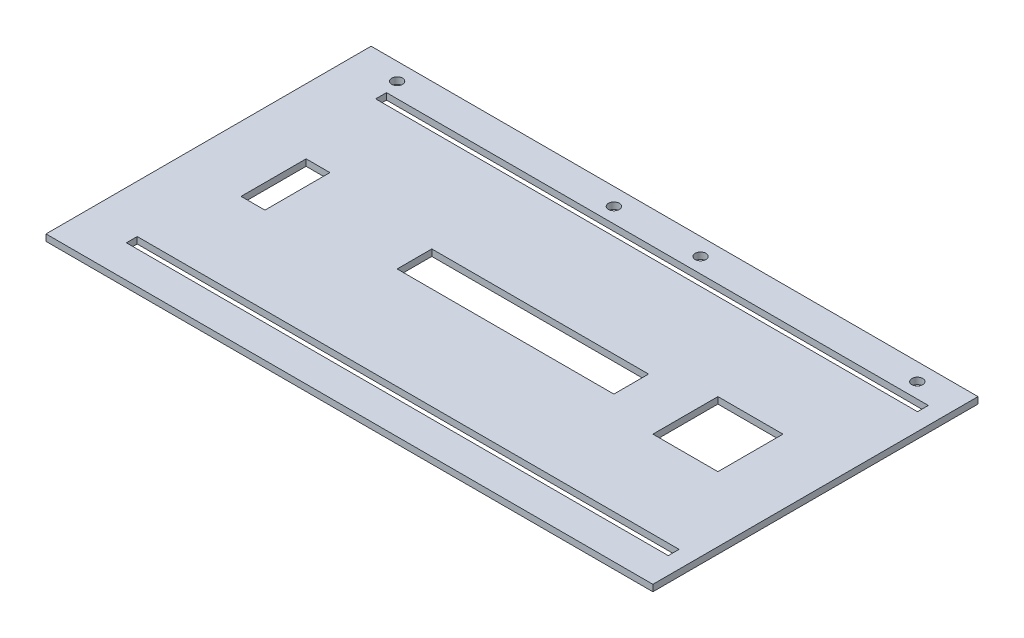
ISO-10303-21;
HEADER;
FILE_DESCRIPTION(('STEP AP214'),'2;1');
FILE_NAME('part.step','',(''),(''),'','','');
FILE_SCHEMA(('AUTOMOTIVE_DESIGN { 1 0 10303 214 1 1 1 1 }'));
ENDSEC;
DATA;
#1=APPLICATION_CONTEXT('core data for automotive mechanical design processes');
#2=APPLICATION_PROTOCOL_DEFINITION('international standard','automotive_design',2000,#1);
#3=PRODUCT_CONTEXT('',#1,'mechanical');
#4=PRODUCT('Part','Part','',(#3));
#5=PRODUCT_RELATED_PRODUCT_CATEGORY('part','',(#4));
#6=PRODUCT_DEFINITION_FORMATION('','',#4);
#7=PRODUCT_DEFINITION_CONTEXT('part definition',#1,'design');
#8=PRODUCT_DEFINITION('design','',#6,#7);
#9=PRODUCT_DEFINITION_SHAPE('','',#8);
#10=(LENGTH_UNIT() NAMED_UNIT(*) SI_UNIT(.MILLI.,.METRE.));
#11=(NAMED_UNIT(*) PLANE_ANGLE_UNIT() SI_UNIT($,.RADIAN.));
#12=(NAMED_UNIT(*) SI_UNIT($,.STERADIAN.) SOLID_ANGLE_UNIT());
#13=UNCERTAINTY_MEASURE_WITH_UNIT(LENGTH_MEASURE(1.E-05),#10,'distance_accuracy_value','');
#14=(GEOMETRIC_REPRESENTATION_CONTEXT(3) GLOBAL_UNCERTAINTY_ASSIGNED_CONTEXT((#13)) GLOBAL_UNIT_ASSIGNED_CONTEXT((#10,
#11,#12)) REPRESENTATION_CONTEXT('',''));
#15=CARTESIAN_POINT('',(0.,0.,0.));
#16=DIRECTION('',(0.,0.,1.));
#17=DIRECTION('',(1.,0.,0.));
#18=AXIS2_PLACEMENT_3D('',#15,#16,#17);
#19=CARTESIAN_POINT('',(-70.1772492460254,3.,-39.3358510671389));
#20=DIRECTION('',(1.,0.,0.));
#21=DIRECTION('',(0.,0.,-1.));
#22=AXIS2_PLACEMENT_3D('',#19,#20,#21);
#23=PLANE('',#22);
#24=DIRECTION('',(0.,0.,1.));
#25=VECTOR('',#24,1.);
#26=CARTESIAN_POINT('',(-70.1772492460254,0.,-39.3358510671389));
#27=LINE('',#26,#25);
#28=CARTESIAN_POINT('',(-70.1772492460254,0.,-39.3358510671389));
#29=VERTEX_POINT('',#28);
#30=CARTESIAN_POINT('',(-70.1772492460254,0.,110.664148932861));
#31=VERTEX_POINT('',#30);
#32=EDGE_CURVE('E385',#29,#31,#27,.T.);
#33=ORIENTED_EDGE('',*,*,#32,.T.);
#34=DIRECTION('',(0.,-1.,0.));
#35=VECTOR('',#34,1.);
#36=CARTESIAN_POINT('',(-70.1772492460254,3.,110.664148932861));
#37=LINE('',#36,#35);
#38=CARTESIAN_POINT('',(-70.1772492460254,3.,110.664148932861));
#39=VERTEX_POINT('',#38);
#40=EDGE_CURVE('E11',#39,#31,#37,.T.);
#41=ORIENTED_EDGE('',*,*,#40,.F.);
#42=DIRECTION('',(0.,0.,1.));
#43=VECTOR('',#42,1.);
#44=CARTESIAN_POINT('',(-70.1772492460254,3.,-39.3358510671389));
#45=LINE('',#44,#43);
#46=CARTESIAN_POINT('',(-70.1772492460254,3.,-39.3358510671389));
#47=VERTEX_POINT('',#46);
#48=EDGE_CURVE('E392',#47,#39,#45,.T.);
#49=ORIENTED_EDGE('',*,*,#48,.F.);
#50=DIRECTION('',(0.,-1.,0.));
#51=VECTOR('',#50,1.);
#52=CARTESIAN_POINT('',(-70.1772492460254,3.,-39.3358510671389));
#53=LINE('',#52,#51);
#54=EDGE_CURVE('E402',#47,#29,#53,.T.);
#55=ORIENTED_EDGE('',*,*,#54,.T.);
#56=EDGE_LOOP('',(#33,#41,#49,#55));
#57=FACE_BOUND('',#56,.T.);
#58=ADVANCED_FACE('F41',(#57),#23,.F.);
#59=CARTESIAN_POINT('',(-70.1772492460254,3.,110.664148932861));
#60=DIRECTION('',(0.,0.,-1.));
#61=DIRECTION('',(-1.,0.,0.));
#62=AXIS2_PLACEMENT_3D('',#59,#60,#61);
#63=PLANE('',#62);
#64=DIRECTION('',(1.,0.,0.));
#65=VECTOR('',#64,1.);
#66=CARTESIAN_POINT('',(-70.1772492460254,0.,110.664148932861));
#67=LINE('',#66,#65);
#68=CARTESIAN_POINT('',(209.822750753975,0.,110.664148932861));
#69=VERTEX_POINT('',#68);
#70=EDGE_CURVE('E405',#31,#69,#67,.T.);
#71=ORIENTED_EDGE('',*,*,#70,.T.);
#72=DIRECTION('',(0.,-1.,0.));
#73=VECTOR('',#72,1.);
#74=CARTESIAN_POINT('',(209.822750753975,3.,110.664148932861));
#75=LINE('',#74,#73);
#76=CARTESIAN_POINT('',(209.822750753975,3.,110.664148932861));
#77=VERTEX_POINT('',#76);
#78=EDGE_CURVE('E48',#77,#69,#75,.T.);
#79=ORIENTED_EDGE('',*,*,#78,.F.);
#80=DIRECTION('',(1.,0.,0.));
#81=VECTOR('',#80,1.);
#82=CARTESIAN_POINT('',(-70.1772492460254,3.,110.664148932861));
#83=LINE('',#82,#81);
#84=EDGE_CURVE('E395',#39,#77,#83,.T.);
#85=ORIENTED_EDGE('',*,*,#84,.F.);
#86=ORIENTED_EDGE('',*,*,#40,.T.);
#87=EDGE_LOOP('',(#71,#79,#85,#86));
#88=FACE_BOUND('',#87,.T.);
#89=ADVANCED_FACE('F434',(#88),#63,.F.);
#90=CARTESIAN_POINT('',(209.822750753975,3.,-39.3358510671389));
#91=DIRECTION('',(-1.,0.,0.));
#92=DIRECTION('',(0.,0.,1.));
#93=AXIS2_PLACEMENT_3D('',#90,#91,#92);
#94=PLANE('',#93);
#95=DIRECTION('',(0.,0.,-1.));
#96=VECTOR('',#95,1.);
#97=CARTESIAN_POINT('',(209.822750753975,0.,-39.3358510671389));
#98=LINE('',#97,#96);
#99=CARTESIAN_POINT('',(209.822750753975,0.,-39.3358510671389));
#100=VERTEX_POINT('',#99);
#101=EDGE_CURVE('E407',#69,#100,#98,.T.);
#102=ORIENTED_EDGE('',*,*,#101,.T.);
#103=DIRECTION('',(0.,-1.,0.));
#104=VECTOR('',#103,1.);
#105=CARTESIAN_POINT('',(209.822750753975,3.,-39.3358510671389));
#106=LINE('',#105,#104);
#107=CARTESIAN_POINT('',(209.822750753975,3.,-39.3358510671389));
#108=VERTEX_POINT('',#107);
#109=EDGE_CURVE('E412',#108,#100,#106,.T.);
#110=ORIENTED_EDGE('',*,*,#109,.F.);
#111=DIRECTION('',(0.,0.,-1.));
#112=VECTOR('',#111,1.);
#113=CARTESIAN_POINT('',(209.822750753975,3.,-39.3358510671389));
#114=LINE('',#113,#112);
#115=EDGE_CURVE('E398',#77,#108,#114,.T.);
#116=ORIENTED_EDGE('',*,*,#115,.F.);
#117=ORIENTED_EDGE('',*,*,#78,.T.);
#118=EDGE_LOOP('',(#102,#110,#116,#117));
#119=FACE_BOUND('',#118,.T.);
#120=ADVANCED_FACE('F419',(#119),#94,.F.);
#121=CARTESIAN_POINT('',(-70.1772492460254,3.,-39.3358510671389));
#122=DIRECTION('',(0.,0.,1.));
#123=DIRECTION('',(1.,0.,0.));
#124=AXIS2_PLACEMENT_3D('',#121,#122,#123);
#125=PLANE('',#124);
#126=DIRECTION('',(-1.,0.,0.));
#127=VECTOR('',#126,1.);
#128=CARTESIAN_POINT('',(-70.1772492460254,0.,-39.3358510671389));
#129=LINE('',#128,#127);
#130=EDGE_CURVE('E396',#100,#29,#129,.T.);
#131=ORIENTED_EDGE('',*,*,#130,.T.);
#132=ORIENTED_EDGE('',*,*,#54,.F.);
#133=DIRECTION('',(-1.,0.,0.));
#134=VECTOR('',#133,1.);
#135=CARTESIAN_POINT('',(-70.1772492460254,3.,-39.3358510671389));
#136=LINE('',#135,#134);
#137=EDGE_CURVE('E400',#108,#47,#136,.T.);
#138=ORIENTED_EDGE('',*,*,#137,.F.);
#139=ORIENTED_EDGE('',*,*,#109,.T.);
#140=EDGE_LOOP('',(#131,#132,#138,#139));
#141=FACE_BOUND('',#140,.T.);
#142=ADVANCED_FACE('F428',(#141),#125,.F.);
#143=CARTESIAN_POINT('',(0.,3.,0.));
#144=DIRECTION('',(0.,1.,0.));
#145=DIRECTION('',(0.,0.,1.));
#146=AXIS2_PLACEMENT_3D('',#143,#144,#145);
#147=PLANE('',#146);
#148=DIRECTION('',(0.,0.,-1.));
#149=VECTOR('',#148,1.);
#150=CARTESIAN_POINT('',(149.822750753975,3.,50.6641489328611));
#151=LINE('',#150,#149);
#152=CARTESIAN_POINT('',(149.822750753975,3.,50.6641489328611));
#153=VERTEX_POINT('',#152);
#154=CARTESIAN_POINT('',(149.822750753975,3.,20.6641489328611));
#155=VERTEX_POINT('',#154);
#156=EDGE_CURVE('E205',#153,#155,#151,.T.);
#157=ORIENTED_EDGE('',*,*,#156,.T.);
#158=DIRECTION('',(1.,0.,0.));
#159=VECTOR('',#158,1.);
#160=CARTESIAN_POINT('',(149.822750753975,3.,20.6641489328611));
#161=LINE('',#160,#159);
#162=CARTESIAN_POINT('',(179.822750753975,3.,20.6641489328611));
#163=VERTEX_POINT('',#162);
#164=EDGE_CURVE('E216',#155,#163,#161,.T.);
#165=ORIENTED_EDGE('',*,*,#164,.T.);
#166=DIRECTION('',(0.,0.,1.));
#167=VECTOR('',#166,1.);
#168=CARTESIAN_POINT('',(179.822750753975,3.,50.6641489328611));
#169=LINE('',#168,#167);
#170=CARTESIAN_POINT('',(179.822750753975,3.,50.6641489328611));
#171=VERTEX_POINT('',#170);
#172=EDGE_CURVE('E55',#163,#171,#169,.T.);
#173=ORIENTED_EDGE('',*,*,#172,.T.);
#174=DIRECTION('',(-1.,0.,0.));
#175=VECTOR('',#174,1.);
#176=CARTESIAN_POINT('',(149.822750753975,3.,50.6641489328611));
#177=LINE('',#176,#175);
#178=EDGE_CURVE('E213',#171,#153,#177,.T.);
#179=ORIENTED_EDGE('',*,*,#178,.T.);
#180=EDGE_LOOP('',(#157,#165,#173,#179));
#181=FACE_BOUND('',#180,.T.);
#182=DIRECTION('',(0.,0.,1.));
#183=VECTOR('',#182,1.);
#184=CARTESIAN_POINT('',(-29.1772492460254,3.,50.6641489328611));
#185=LINE('',#184,#183);
#186=CARTESIAN_POINT('',(-29.1772492460254,3.,20.6641489328611));
#187=VERTEX_POINT('',#186);
#188=CARTESIAN_POINT('',(-29.1772492460254,3.,50.6641489328611));
#189=VERTEX_POINT('',#188);
#190=EDGE_CURVE('E257',#187,#189,#185,.T.);
#191=ORIENTED_EDGE('',*,*,#190,.T.);
#192=DIRECTION('',(-1.,0.,0.));
#193=VECTOR('',#192,1.);
#194=CARTESIAN_POINT('',(-29.1772492460254,3.,50.6641489328611));
#195=LINE('',#194,#193);
#196=CARTESIAN_POINT('',(-40.1772492460254,3.,50.6641489328611));
#197=VERTEX_POINT('',#196);
#198=EDGE_CURVE('E267',#189,#197,#195,.T.);
#199=ORIENTED_EDGE('',*,*,#198,.T.);
#200=DIRECTION('',(0.,0.,-1.));
#201=VECTOR('',#200,1.);
#202=CARTESIAN_POINT('',(-40.1772492460254,3.,50.6641489328611));
#203=LINE('',#202,#201);
#204=CARTESIAN_POINT('',(-40.1772492460254,3.,20.6641489328611));
#205=VERTEX_POINT('',#204);
#206=EDGE_CURVE('E63',#197,#205,#203,.T.);
#207=ORIENTED_EDGE('',*,*,#206,.T.);
#208=DIRECTION('',(1.,0.,0.));
#209=VECTOR('',#208,1.);
#210=CARTESIAN_POINT('',(-29.1772492460254,3.,20.6641489328611));
#211=LINE('',#210,#209);
#212=EDGE_CURVE('E246',#205,#187,#211,.T.);
#213=ORIENTED_EDGE('',*,*,#212,.T.);
#214=EDGE_LOOP('',(#191,#199,#207,#213));
#215=FACE_BOUND('',#214,.T.);
#216=CARTESIAN_POINT('',(-50.1772492460254,3.,-31.3358510671389));
#217=DIRECTION('',(0.,1.,0.));
#218=DIRECTION('',(0.,0.,1.));
#219=AXIS2_PLACEMENT_3D('',#216,#217,#218);
#220=CIRCLE('',#219,2.5);
#221=CARTESIAN_POINT('',(-50.1772492460254,3.,-28.8358510671389));
#222=VERTEX_POINT('',#221);
#223=EDGE_CURVE('E276',#222,#222,#220,.T.);
#224=ORIENTED_EDGE('',*,*,#223,.F.);
#225=EDGE_LOOP('',(#224));
#226=FACE_BOUND('',#225,.T.);
#227=CARTESIAN_POINT('',(89.8227507539747,3.,-31.3358510671389));
#228=DIRECTION('',(0.,1.,0.));
#229=DIRECTION('',(0.,0.,1.));
#230=AXIS2_PLACEMENT_3D('',#227,#228,#229);
#231=CIRCLE('',#230,2.5);
#232=CARTESIAN_POINT('',(89.8227507539747,3.,-28.8358510671389));
#233=VERTEX_POINT('',#232);
#234=EDGE_CURVE('E280',#233,#233,#231,.T.);
#235=ORIENTED_EDGE('',*,*,#234,.F.);
#236=EDGE_LOOP('',(#235));
#237=FACE_BOUND('',#236,.T.);
#238=CARTESIAN_POINT('',(189.822750753975,3.,-31.3358510671389));
#239=DIRECTION('',(0.,1.,0.));
#240=DIRECTION('',(0.,0.,1.));
#241=AXIS2_PLACEMENT_3D('',#238,#239,#240);
#242=CIRCLE('',#241,2.5);
#243=CARTESIAN_POINT('',(189.822750753975,3.,-28.8358510671389));
#244=VERTEX_POINT('',#243);
#245=EDGE_CURVE('E291',#244,#244,#242,.T.);
#246=ORIENTED_EDGE('',*,*,#245,.F.);
#247=EDGE_LOOP('',(#246));
#248=FACE_BOUND('',#247,.T.);
#249=CARTESIAN_POINT('',(49.8227507539746,3.,-31.3358510671389));
#250=DIRECTION('',(0.,1.,0.));
#251=DIRECTION('',(0.,0.,1.));
#252=AXIS2_PLACEMENT_3D('',#249,#250,#251);
#253=CIRCLE('',#252,2.5);
#254=CARTESIAN_POINT('',(49.8227507539746,3.,-28.8358510671389));
#255=VERTEX_POINT('',#254);
#256=EDGE_CURVE('E279',#255,#255,#253,.T.);
#257=ORIENTED_EDGE('',*,*,#256,.F.);
#258=EDGE_LOOP('',(#257));
#259=FACE_BOUND('',#258,.T.);
#260=DIRECTION('',(0.,0.,-1.));
#261=VECTOR('',#260,1.);
#262=CARTESIAN_POINT('',(-48.0896476537068,3.,95.6641489328611));
#263=LINE('',#262,#261);
#264=CARTESIAN_POINT('',(-48.0896476537068,3.,95.6641489328611));
#265=VERTEX_POINT('',#264);
#266=CARTESIAN_POINT('',(-48.0896476537068,3.,90.6641489328611));
#267=VERTEX_POINT('',#266);
#268=EDGE_CURVE('E296',#265,#267,#263,.T.);
#269=ORIENTED_EDGE('',*,*,#268,.T.);
#270=DIRECTION('',(1.,0.,0.));
#271=VECTOR('',#270,1.);
#272=CARTESIAN_POINT('',(-48.0896476537068,3.,90.6641489328611));
#273=LINE('',#272,#271);
#274=CARTESIAN_POINT('',(201.910352346293,3.,90.6641489328611));
#275=VERTEX_POINT('',#274);
#276=EDGE_CURVE('E299',#267,#275,#273,.T.);
#277=ORIENTED_EDGE('',*,*,#276,.T.);
#278=DIRECTION('',(0.,0.,1.));
#279=VECTOR('',#278,1.);
#280=CARTESIAN_POINT('',(201.910352346293,3.,95.6641489328611));
#281=LINE('',#280,#279);
#282=CARTESIAN_POINT('',(201.910352346293,3.,95.6641489328611));
#283=VERTEX_POINT('',#282);
#284=EDGE_CURVE('E303',#275,#283,#281,.T.);
#285=ORIENTED_EDGE('',*,*,#284,.T.);
#286=DIRECTION('',(-1.,0.,0.));
#287=VECTOR('',#286,1.);
#288=CARTESIAN_POINT('',(-48.0896476537068,3.,95.6641489328611));
#289=LINE('',#288,#287);
#290=EDGE_CURVE('E306',#283,#265,#289,.T.);
#291=ORIENTED_EDGE('',*,*,#290,.T.);
#292=EDGE_LOOP('',(#269,#277,#285,#291));
#293=FACE_BOUND('',#292,.T.);
#294=DIRECTION('',(0.,0.,-1.));
#295=VECTOR('',#294,1.);
#296=CARTESIAN_POINT('',(-48.0896476537068,3.,-19.3358510671389));
#297=LINE('',#296,#295);
#298=CARTESIAN_POINT('',(-48.0896476537068,3.,-19.3358510671389));
#299=VERTEX_POINT('',#298);
#300=CARTESIAN_POINT('',(-48.0896476537068,3.,-24.3358510671389));
#301=VERTEX_POINT('',#300);
#302=EDGE_CURVE('E343',#299,#301,#297,.T.);
#303=ORIENTED_EDGE('',*,*,#302,.T.);
#304=DIRECTION('',(1.,0.,0.));
#305=VECTOR('',#304,1.);
#306=CARTESIAN_POINT('',(-48.0896476537068,3.,-24.3358510671389));
#307=LINE('',#306,#305);
#308=CARTESIAN_POINT('',(201.910352346293,3.,-24.3358510671389));
#309=VERTEX_POINT('',#308);
#310=EDGE_CURVE('E355',#301,#309,#307,.T.);
#311=ORIENTED_EDGE('',*,*,#310,.T.);
#312=DIRECTION('',(0.,0.,1.));
#313=VECTOR('',#312,1.);
#314=CARTESIAN_POINT('',(201.910352346293,3.,-19.3358510671389));
#315=LINE('',#314,#313);
#316=CARTESIAN_POINT('',(201.910352346293,3.,-19.3358510671389));
#317=VERTEX_POINT('',#316);
#318=EDGE_CURVE('E352',#309,#317,#315,.T.);
#319=ORIENTED_EDGE('',*,*,#318,.T.);
#320=DIRECTION('',(-1.,0.,0.));
#321=VECTOR('',#320,1.);
#322=CARTESIAN_POINT('',(-48.0896476537068,3.,-19.3358510671389));
#323=LINE('',#322,#321);
#324=EDGE_CURVE('E333',#317,#299,#323,.T.);
#325=ORIENTED_EDGE('',*,*,#324,.T.);
#326=EDGE_LOOP('',(#303,#311,#319,#325));
#327=FACE_BOUND('',#326,.T.);
#328=DIRECTION('',(0.,0.,-1.));
#329=VECTOR('',#328,1.);
#330=CARTESIAN_POINT('',(124.822750753975,3.,43.6641489328611));
#331=LINE('',#330,#329);
#332=CARTESIAN_POINT('',(124.822750753975,3.,43.6641489328611));
#333=VERTEX_POINT('',#332);
#334=CARTESIAN_POINT('',(124.822750753975,3.,27.6641489328611));
#335=VERTEX_POINT('',#334);
#336=EDGE_CURVE('E323',#333,#335,#331,.T.);
#337=ORIENTED_EDGE('',*,*,#336,.F.);
#338=DIRECTION('',(1.,0.,0.));
#339=VECTOR('',#338,1.);
#340=CARTESIAN_POINT('',(24.8227507539747,3.,43.6641489328611));
#341=LINE('',#340,#339);
#342=CARTESIAN_POINT('',(24.8227507539747,3.,43.6641489328611));
#343=VERTEX_POINT('',#342);
#344=EDGE_CURVE('E364',#343,#333,#341,.T.);
#345=ORIENTED_EDGE('',*,*,#344,.F.);
#346=DIRECTION('',(0.,0.,1.));
#347=VECTOR('',#346,1.);
#348=CARTESIAN_POINT('',(24.8227507539747,3.,43.6641489328611));
#349=LINE('',#348,#347);
#350=CARTESIAN_POINT('',(24.8227507539747,3.,27.6641489328611));
#351=VERTEX_POINT('',#350);
#352=EDGE_CURVE('E378',#351,#343,#349,.T.);
#353=ORIENTED_EDGE('',*,*,#352,.F.);
#354=DIRECTION('',(-1.,0.,0.));
#355=VECTOR('',#354,1.);
#356=CARTESIAN_POINT('',(24.8227507539747,3.,27.6641489328611));
#357=LINE('',#356,#355);
#358=EDGE_CURVE('E375',#335,#351,#357,.T.);
#359=ORIENTED_EDGE('',*,*,#358,.F.);
#360=EDGE_LOOP('',(#337,#345,#353,#359));
#361=FACE_BOUND('',#360,.T.);
#362=ORIENTED_EDGE('',*,*,#48,.T.);
#363=ORIENTED_EDGE('',*,*,#84,.T.);
#364=ORIENTED_EDGE('',*,*,#115,.T.);
#365=ORIENTED_EDGE('',*,*,#137,.T.);
#366=EDGE_LOOP('',(#362,#363,#364,#365));
#367=FACE_BOUND('',#366,.T.);
#368=ADVANCED_FACE('F220',(#181,#215,#226,#237,#248,#259,#293,#327,#361,#367),#147,.T.);
#369=CARTESIAN_POINT('',(0.,0.,0.));
#370=DIRECTION('',(0.,1.,0.));
#371=DIRECTION('',(0.,0.,1.));
#372=AXIS2_PLACEMENT_3D('',#369,#370,#371);
#373=PLANE('',#372);
#374=DIRECTION('',(1.,0.,0.));
#375=VECTOR('',#374,1.);
#376=CARTESIAN_POINT('',(149.822750753975,0.,20.6641489328611));
#377=LINE('',#376,#375);
#378=CARTESIAN_POINT('',(149.822750753975,0.,20.6641489328611));
#379=VERTEX_POINT('',#378);
#380=CARTESIAN_POINT('',(179.822750753975,0.,20.6641489328611));
#381=VERTEX_POINT('',#380);
#382=EDGE_CURVE('E232',#379,#381,#377,.T.);
#383=ORIENTED_EDGE('',*,*,#382,.F.);
#384=DIRECTION('',(0.,0.,-1.));
#385=VECTOR('',#384,1.);
#386=CARTESIAN_POINT('',(149.822750753975,0.,50.6641489328611));
#387=LINE('',#386,#385);
#388=CARTESIAN_POINT('',(149.822750753975,0.,50.6641489328611));
#389=VERTEX_POINT('',#388);
#390=EDGE_CURVE('E208',#389,#379,#387,.T.);
#391=ORIENTED_EDGE('',*,*,#390,.F.);
#392=DIRECTION('',(-1.,0.,0.));
#393=VECTOR('',#392,1.);
#394=CARTESIAN_POINT('',(149.822750753975,0.,50.6641489328611));
#395=LINE('',#394,#393);
#396=CARTESIAN_POINT('',(179.822750753975,0.,50.6641489328611));
#397=VERTEX_POINT('',#396);
#398=EDGE_CURVE('E223',#397,#389,#395,.T.);
#399=ORIENTED_EDGE('',*,*,#398,.F.);
#400=DIRECTION('',(0.,0.,1.));
#401=VECTOR('',#400,1.);
#402=CARTESIAN_POINT('',(179.822750753975,0.,50.6641489328611));
#403=LINE('',#402,#401);
#404=EDGE_CURVE('E226',#381,#397,#403,.T.);
#405=ORIENTED_EDGE('',*,*,#404,.F.);
#406=EDGE_LOOP('',(#383,#391,#399,#405));
#407=FACE_BOUND('',#406,.T.);
#408=DIRECTION('',(-1.,0.,0.));
#409=VECTOR('',#408,1.);
#410=CARTESIAN_POINT('',(-29.1772492460254,0.,50.6641489328611));
#411=LINE('',#410,#409);
#412=CARTESIAN_POINT('',(-29.1772492460254,0.,50.6641489328611));
#413=VERTEX_POINT('',#412);
#414=CARTESIAN_POINT('',(-40.1772492460254,0.,50.6641489328611));
#415=VERTEX_POINT('',#414);
#416=EDGE_CURVE('E260',#413,#415,#411,.T.);
#417=ORIENTED_EDGE('',*,*,#416,.F.);
#418=DIRECTION('',(0.,0.,1.));
#419=VECTOR('',#418,1.);
#420=CARTESIAN_POINT('',(-29.1772492460254,0.,50.6641489328611));
#421=LINE('',#420,#419);
#422=CARTESIAN_POINT('',(-29.1772492460254,0.,20.6641489328611));
#423=VERTEX_POINT('',#422);
#424=EDGE_CURVE('E233',#423,#413,#421,.T.);
#425=ORIENTED_EDGE('',*,*,#424,.F.);
#426=DIRECTION('',(1.,0.,0.));
#427=VECTOR('',#426,1.);
#428=CARTESIAN_POINT('',(-29.1772492460254,0.,20.6641489328611));
#429=LINE('',#428,#427);
#430=CARTESIAN_POINT('',(-40.1772492460254,0.,20.6641489328611));
#431=VERTEX_POINT('',#430);
#432=EDGE_CURVE('E253',#431,#423,#429,.T.);
#433=ORIENTED_EDGE('',*,*,#432,.F.);
#434=DIRECTION('',(0.,0.,-1.));
#435=VECTOR('',#434,1.);
#436=CARTESIAN_POINT('',(-40.1772492460254,0.,50.6641489328611));
#437=LINE('',#436,#435);
#438=EDGE_CURVE('E256',#415,#431,#437,.T.);
#439=ORIENTED_EDGE('',*,*,#438,.F.);
#440=EDGE_LOOP('',(#417,#425,#433,#439));
#441=FACE_BOUND('',#440,.T.);
#442=CARTESIAN_POINT('',(-50.1772492460254,0.,-31.3358510671389));
#443=DIRECTION('',(0.,1.,0.));
#444=DIRECTION('',(0.,0.,1.));
#445=AXIS2_PLACEMENT_3D('',#442,#443,#444);
#446=CIRCLE('',#445,2.5);
#447=CARTESIAN_POINT('',(-50.1772492460254,0.,-28.8358510671389));
#448=VERTEX_POINT('',#447);
#449=EDGE_CURVE('E272',#448,#448,#446,.T.);
#450=ORIENTED_EDGE('',*,*,#449,.T.);
#451=EDGE_LOOP('',(#450));
#452=FACE_BOUND('',#451,.T.);
#453=CARTESIAN_POINT('',(89.8227507539747,0.,-31.3358510671389));
#454=DIRECTION('',(0.,1.,0.));
#455=DIRECTION('',(0.,0.,1.));
#456=AXIS2_PLACEMENT_3D('',#453,#454,#455);
#457=CIRCLE('',#456,2.5);
#458=CARTESIAN_POINT('',(89.8227507539747,0.,-28.8358510671389));
#459=VERTEX_POINT('',#458);
#460=EDGE_CURVE('E239',#459,#459,#457,.T.);
#461=ORIENTED_EDGE('',*,*,#460,.T.);
#462=EDGE_LOOP('',(#461));
#463=FACE_BOUND('',#462,.T.);
#464=CARTESIAN_POINT('',(189.822750753975,0.,-31.3358510671389));
#465=DIRECTION('',(0.,1.,0.));
#466=DIRECTION('',(0.,0.,1.));
#467=AXIS2_PLACEMENT_3D('',#464,#465,#466);
#468=CIRCLE('',#467,2.5);
#469=CARTESIAN_POINT('',(189.822750753975,0.,-28.8358510671389));
#470=VERTEX_POINT('',#469);
#471=EDGE_CURVE('E283',#470,#470,#468,.T.);
#472=ORIENTED_EDGE('',*,*,#471,.T.);
#473=EDGE_LOOP('',(#472));
#474=FACE_BOUND('',#473,.T.);
#475=CARTESIAN_POINT('',(49.8227507539746,0.,-31.3358510671389));
#476=DIRECTION('',(0.,1.,0.));
#477=DIRECTION('',(0.,0.,1.));
#478=AXIS2_PLACEMENT_3D('',#475,#476,#477);
#479=CIRCLE('',#478,2.5);
#480=CARTESIAN_POINT('',(49.8227507539746,0.,-28.8358510671389));
#481=VERTEX_POINT('',#480);
#482=EDGE_CURVE('E288',#481,#481,#479,.T.);
#483=ORIENTED_EDGE('',*,*,#482,.T.);
#484=EDGE_LOOP('',(#483));
#485=FACE_BOUND('',#484,.T.);
#486=DIRECTION('',(1.,0.,0.));
#487=VECTOR('',#486,1.);
#488=CARTESIAN_POINT('',(-48.0896476537068,0.,90.6641489328611));
#489=LINE('',#488,#487);
#490=CARTESIAN_POINT('',(-48.0896476537068,0.,90.6641489328611));
#491=VERTEX_POINT('',#490);
#492=CARTESIAN_POINT('',(201.910352346293,0.,90.6641489328611));
#493=VERTEX_POINT('',#492);
#494=EDGE_CURVE('E312',#491,#493,#489,.T.);
#495=ORIENTED_EDGE('',*,*,#494,.F.);
#496=DIRECTION('',(0.,0.,-1.));
#497=VECTOR('',#496,1.);
#498=CARTESIAN_POINT('',(-48.0896476537068,0.,95.6641489328611));
#499=LINE('',#498,#497);
#500=CARTESIAN_POINT('',(-48.0896476537068,0.,95.6641489328611));
#501=VERTEX_POINT('',#500);
#502=EDGE_CURVE('E310',#501,#491,#499,.T.);
#503=ORIENTED_EDGE('',*,*,#502,.F.);
#504=DIRECTION('',(-1.,0.,0.));
#505=VECTOR('',#504,1.);
#506=CARTESIAN_POINT('',(-48.0896476537068,0.,95.6641489328611));
#507=LINE('',#506,#505);
#508=CARTESIAN_POINT('',(201.910352346293,0.,95.6641489328611));
#509=VERTEX_POINT('',#508);
#510=EDGE_CURVE('E300',#509,#501,#507,.T.);
#511=ORIENTED_EDGE('',*,*,#510,.F.);
#512=DIRECTION('',(0.,0.,1.));
#513=VECTOR('',#512,1.);
#514=CARTESIAN_POINT('',(201.910352346293,0.,95.6641489328611));
#515=LINE('',#514,#513);
#516=EDGE_CURVE('E316',#493,#509,#515,.T.);
#517=ORIENTED_EDGE('',*,*,#516,.F.);
#518=EDGE_LOOP('',(#495,#503,#511,#517));
#519=FACE_BOUND('',#518,.T.);
#520=DIRECTION('',(1.,0.,0.));
#521=VECTOR('',#520,1.);
#522=CARTESIAN_POINT('',(-48.0896476537068,0.,-24.3358510671389));
#523=LINE('',#522,#521);
#524=CARTESIAN_POINT('',(-48.0896476537068,0.,-24.3358510671389));
#525=VERTEX_POINT('',#524);
#526=CARTESIAN_POINT('',(201.910352346293,0.,-24.3358510671389));
#527=VERTEX_POINT('',#526);
#528=EDGE_CURVE('E346',#525,#527,#523,.T.);
#529=ORIENTED_EDGE('',*,*,#528,.F.);
#530=DIRECTION('',(0.,0.,-1.));
#531=VECTOR('',#530,1.);
#532=CARTESIAN_POINT('',(-48.0896476537068,0.,-19.3358510671389));
#533=LINE('',#532,#531);
#534=CARTESIAN_POINT('',(-48.0896476537068,0.,-19.3358510671389));
#535=VERTEX_POINT('',#534);
#536=EDGE_CURVE('E313',#535,#525,#533,.T.);
#537=ORIENTED_EDGE('',*,*,#536,.F.);
#538=DIRECTION('',(-1.,0.,0.));
#539=VECTOR('',#538,1.);
#540=CARTESIAN_POINT('',(-48.0896476537068,0.,-19.3358510671389));
#541=LINE('',#540,#539);
#542=CARTESIAN_POINT('',(201.910352346293,0.,-19.3358510671389));
#543=VERTEX_POINT('',#542);
#544=EDGE_CURVE('E339',#543,#535,#541,.T.);
#545=ORIENTED_EDGE('',*,*,#544,.F.);
#546=DIRECTION('',(0.,0.,1.));
#547=VECTOR('',#546,1.);
#548=CARTESIAN_POINT('',(201.910352346293,0.,-19.3358510671389));
#549=LINE('',#548,#547);
#550=EDGE_CURVE('E342',#527,#543,#549,.T.);
#551=ORIENTED_EDGE('',*,*,#550,.F.);
#552=EDGE_LOOP('',(#529,#537,#545,#551));
#553=FACE_BOUND('',#552,.T.);
#554=DIRECTION('',(1.,0.,0.));
#555=VECTOR('',#554,1.);
#556=CARTESIAN_POINT('',(24.8227507539747,0.,43.6641489328611));
#557=LINE('',#556,#555);
#558=CARTESIAN_POINT('',(24.8227507539747,0.,43.6641489328611));
#559=VERTEX_POINT('',#558);
#560=CARTESIAN_POINT('',(124.822750753975,0.,43.6641489328611));
#561=VERTEX_POINT('',#560);
#562=EDGE_CURVE('E370',#559,#561,#557,.T.);
#563=ORIENTED_EDGE('',*,*,#562,.T.);
#564=DIRECTION('',(0.,0.,-1.));
#565=VECTOR('',#564,1.);
#566=CARTESIAN_POINT('',(124.822750753975,0.,43.6641489328611));
#567=LINE('',#566,#565);
#568=CARTESIAN_POINT('',(124.822750753975,0.,27.6641489328611));
#569=VERTEX_POINT('',#568);
#570=EDGE_CURVE('E360',#561,#569,#567,.T.);
#571=ORIENTED_EDGE('',*,*,#570,.T.);
#572=DIRECTION('',(-1.,0.,0.));
#573=VECTOR('',#572,1.);
#574=CARTESIAN_POINT('',(24.8227507539747,0.,27.6641489328611));
#575=LINE('',#574,#573);
#576=CARTESIAN_POINT('',(24.8227507539747,0.,27.6641489328611));
#577=VERTEX_POINT('',#576);
#578=EDGE_CURVE('E363',#569,#577,#575,.T.);
#579=ORIENTED_EDGE('',*,*,#578,.T.);
#580=DIRECTION('',(0.,0.,1.));
#581=VECTOR('',#580,1.);
#582=CARTESIAN_POINT('',(24.8227507539747,0.,43.6641489328611));
#583=LINE('',#582,#581);
#584=EDGE_CURVE('E367',#577,#559,#583,.T.);
#585=ORIENTED_EDGE('',*,*,#584,.T.);
#586=EDGE_LOOP('',(#563,#571,#579,#585));
#587=FACE_BOUND('',#586,.T.);
#588=ORIENTED_EDGE('',*,*,#32,.F.);
#589=ORIENTED_EDGE('',*,*,#130,.F.);
#590=ORIENTED_EDGE('',*,*,#101,.F.);
#591=ORIENTED_EDGE('',*,*,#70,.F.);
#592=EDGE_LOOP('',(#588,#589,#590,#591));
#593=FACE_BOUND('',#592,.T.);
#594=ADVANCED_FACE('F425',(#407,#441,#452,#463,#474,#485,#519,#553,#587,#593),#373,.F.);
#595=CARTESIAN_POINT('',(124.822750753975,0.,43.6641489328611));
#596=DIRECTION('',(1.,0.,0.));
#597=DIRECTION('',(0.,0.,-1.));
#598=AXIS2_PLACEMENT_3D('',#595,#596,#597);
#599=PLANE('',#598);
#600=ORIENTED_EDGE('',*,*,#336,.T.);
#601=DIRECTION('',(0.,1.,0.));
#602=VECTOR('',#601,1.);
#603=CARTESIAN_POINT('',(124.822750753975,0.,27.6641489328611));
#604=LINE('',#603,#602);
#605=EDGE_CURVE('E373',#569,#335,#604,.T.);
#606=ORIENTED_EDGE('',*,*,#605,.F.);
#607=ORIENTED_EDGE('',*,*,#570,.F.);
#608=DIRECTION('',(0.,1.,0.));
#609=VECTOR('',#608,1.);
#610=CARTESIAN_POINT('',(124.822750753975,0.,43.6641489328611));
#611=LINE('',#610,#609);
#612=EDGE_CURVE('E383',#561,#333,#611,.T.);
#613=ORIENTED_EDGE('',*,*,#612,.T.);
#614=EDGE_LOOP('',(#600,#606,#607,#613));
#615=FACE_BOUND('',#614,.T.);
#616=ADVANCED_FACE('F446',(#615),#599,.F.);
#617=CARTESIAN_POINT('',(24.8227507539747,0.,43.6641489328611));
#618=DIRECTION('',(0.,0.,1.));
#619=DIRECTION('',(1.,0.,0.));
#620=AXIS2_PLACEMENT_3D('',#617,#618,#619);
#621=PLANE('',#620);
#622=ORIENTED_EDGE('',*,*,#344,.T.);
#623=ORIENTED_EDGE('',*,*,#612,.F.);
#624=ORIENTED_EDGE('',*,*,#562,.F.);
#625=DIRECTION('',(0.,1.,0.));
#626=VECTOR('',#625,1.);
#627=CARTESIAN_POINT('',(24.8227507539747,0.,43.6641489328611));
#628=LINE('',#627,#626);
#629=EDGE_CURVE('E386',#559,#343,#628,.T.);
#630=ORIENTED_EDGE('',*,*,#629,.T.);
#631=EDGE_LOOP('',(#622,#623,#624,#630));
#632=FACE_BOUND('',#631,.T.);
#633=ADVANCED_FACE('F452',(#632),#621,.F.);
#634=CARTESIAN_POINT('',(24.8227507539747,0.,43.6641489328611));
#635=DIRECTION('',(-1.,0.,0.));
#636=DIRECTION('',(0.,0.,1.));
#637=AXIS2_PLACEMENT_3D('',#634,#635,#636);
#638=PLANE('',#637);
#639=ORIENTED_EDGE('',*,*,#352,.T.);
#640=ORIENTED_EDGE('',*,*,#629,.F.);
#641=ORIENTED_EDGE('',*,*,#584,.F.);
#642=DIRECTION('',(0.,1.,0.));
#643=VECTOR('',#642,1.);
#644=CARTESIAN_POINT('',(24.8227507539747,0.,27.6641489328611));
#645=LINE('',#644,#643);
#646=EDGE_CURVE('E388',#577,#351,#645,.T.);
#647=ORIENTED_EDGE('',*,*,#646,.T.);
#648=EDGE_LOOP('',(#639,#640,#641,#647));
#649=FACE_BOUND('',#648,.T.);
#650=ADVANCED_FACE('F458',(#649),#638,.F.);
#651=CARTESIAN_POINT('',(24.8227507539747,0.,27.6641489328611));
#652=DIRECTION('',(0.,0.,-1.));
#653=DIRECTION('',(-1.,0.,0.));
#654=AXIS2_PLACEMENT_3D('',#651,#652,#653);
#655=PLANE('',#654);
#656=ORIENTED_EDGE('',*,*,#358,.T.);
#657=ORIENTED_EDGE('',*,*,#646,.F.);
#658=ORIENTED_EDGE('',*,*,#578,.F.);
#659=ORIENTED_EDGE('',*,*,#605,.T.);
#660=EDGE_LOOP('',(#656,#657,#658,#659));
#661=FACE_BOUND('',#660,.T.);
#662=ADVANCED_FACE('F454',(#661),#655,.F.);
#663=CARTESIAN_POINT('',(-48.0896476537068,3.,-19.3358510671389));
#664=DIRECTION('',(-1.,0.,0.));
#665=DIRECTION('',(0.,0.,1.));
#666=AXIS2_PLACEMENT_3D('',#663,#664,#665);
#667=PLANE('',#666);
#668=ORIENTED_EDGE('',*,*,#536,.T.);
#669=DIRECTION('',(0.,-1.,0.));
#670=VECTOR('',#669,1.);
#671=CARTESIAN_POINT('',(-48.0896476537068,3.,-24.3358510671389));
#672=LINE('',#671,#670);
#673=EDGE_CURVE('E330',#301,#525,#672,.T.);
#674=ORIENTED_EDGE('',*,*,#673,.F.);
#675=ORIENTED_EDGE('',*,*,#302,.F.);
#676=DIRECTION('',(0.,-1.,0.));
#677=VECTOR('',#676,1.);
#678=CARTESIAN_POINT('',(-48.0896476537068,3.,-19.3358510671389));
#679=LINE('',#678,#677);
#680=EDGE_CURVE('E275',#299,#535,#679,.T.);
#681=ORIENTED_EDGE('',*,*,#680,.T.);
#682=EDGE_LOOP('',(#668,#674,#675,#681));
#683=FACE_BOUND('',#682,.T.);
#684=ADVANCED_FACE('F457',(#683),#667,.F.);
#685=CARTESIAN_POINT('',(-48.0896476537068,3.,-19.3358510671389));
#686=DIRECTION('',(0.,0.,1.));
#687=DIRECTION('',(1.,0.,0.));
#688=AXIS2_PLACEMENT_3D('',#685,#686,#687);
#689=PLANE('',#688);
#690=ORIENTED_EDGE('',*,*,#544,.T.);
#691=ORIENTED_EDGE('',*,*,#680,.F.);
#692=ORIENTED_EDGE('',*,*,#324,.F.);
#693=DIRECTION('',(0.,-1.,0.));
#694=VECTOR('',#693,1.);
#695=CARTESIAN_POINT('',(201.910352346293,3.,-19.3358510671389));
#696=LINE('',#695,#694);
#697=EDGE_CURVE('E336',#317,#543,#696,.T.);
#698=ORIENTED_EDGE('',*,*,#697,.T.);
#699=EDGE_LOOP('',(#690,#691,#692,#698));
#700=FACE_BOUND('',#699,.T.);
#701=ADVANCED_FACE('F466',(#700),#689,.F.);
#702=CARTESIAN_POINT('',(201.910352346293,3.,-19.3358510671389));
#703=DIRECTION('',(1.,0.,0.));
#704=DIRECTION('',(0.,0.,-1.));
#705=AXIS2_PLACEMENT_3D('',#702,#703,#704);
#706=PLANE('',#705);
#707=ORIENTED_EDGE('',*,*,#550,.T.);
#708=ORIENTED_EDGE('',*,*,#697,.F.);
#709=ORIENTED_EDGE('',*,*,#318,.F.);
#710=DIRECTION('',(0.,-1.,0.));
#711=VECTOR('',#710,1.);
#712=CARTESIAN_POINT('',(201.910352346293,3.,-24.3358510671389));
#713=LINE('',#712,#711);
#714=EDGE_CURVE('E334',#309,#527,#713,.T.);
#715=ORIENTED_EDGE('',*,*,#714,.T.);
#716=EDGE_LOOP('',(#707,#708,#709,#715));
#717=FACE_BOUND('',#716,.T.);
#718=ADVANCED_FACE('F469',(#717),#706,.F.);
#719=CARTESIAN_POINT('',(-48.0896476537068,3.,-24.3358510671389));
#720=DIRECTION('',(0.,0.,-1.));
#721=DIRECTION('',(-1.,0.,0.));
#722=AXIS2_PLACEMENT_3D('',#719,#720,#721);
#723=PLANE('',#722);
#724=ORIENTED_EDGE('',*,*,#528,.T.);
#725=ORIENTED_EDGE('',*,*,#714,.F.);
#726=ORIENTED_EDGE('',*,*,#310,.F.);
#727=ORIENTED_EDGE('',*,*,#673,.T.);
#728=EDGE_LOOP('',(#724,#725,#726,#727));
#729=FACE_BOUND('',#728,.T.);
#730=ADVANCED_FACE('F473',(#729),#723,.F.);
#731=CARTESIAN_POINT('',(-48.0896476537068,3.,95.6641489328611));
#732=DIRECTION('',(-1.,0.,0.));
#733=DIRECTION('',(0.,0.,1.));
#734=AXIS2_PLACEMENT_3D('',#731,#732,#733);
#735=PLANE('',#734);
#736=ORIENTED_EDGE('',*,*,#502,.T.);
#737=DIRECTION('',(0.,-1.,0.));
#738=VECTOR('',#737,1.);
#739=CARTESIAN_POINT('',(-48.0896476537068,3.,90.6641489328611));
#740=LINE('',#739,#738);
#741=EDGE_CURVE('E309',#267,#491,#740,.T.);
#742=ORIENTED_EDGE('',*,*,#741,.F.);
#743=ORIENTED_EDGE('',*,*,#268,.F.);
#744=DIRECTION('',(0.,-1.,0.));
#745=VECTOR('',#744,1.);
#746=CARTESIAN_POINT('',(-48.0896476537068,3.,95.6641489328611));
#747=LINE('',#746,#745);
#748=EDGE_CURVE('E321',#265,#501,#747,.T.);
#749=ORIENTED_EDGE('',*,*,#748,.T.);
#750=EDGE_LOOP('',(#736,#742,#743,#749));
#751=FACE_BOUND('',#750,.T.);
#752=ADVANCED_FACE('F477',(#751),#735,.F.);
#753=CARTESIAN_POINT('',(-48.0896476537068,3.,95.6641489328611));
#754=DIRECTION('',(0.,0.,1.));
#755=DIRECTION('',(1.,0.,0.));
#756=AXIS2_PLACEMENT_3D('',#753,#754,#755);
#757=PLANE('',#756);
#758=ORIENTED_EDGE('',*,*,#510,.T.);
#759=ORIENTED_EDGE('',*,*,#748,.F.);
#760=ORIENTED_EDGE('',*,*,#290,.F.);
#761=DIRECTION('',(0.,-1.,0.));
#762=VECTOR('',#761,1.);
#763=CARTESIAN_POINT('',(201.910352346293,3.,95.6641489328611));
#764=LINE('',#763,#762);
#765=EDGE_CURVE('E324',#283,#509,#764,.T.);
#766=ORIENTED_EDGE('',*,*,#765,.T.);
#767=EDGE_LOOP('',(#758,#759,#760,#766));
#768=FACE_BOUND('',#767,.T.);
#769=ADVANCED_FACE('F484',(#768),#757,.F.);
#770=CARTESIAN_POINT('',(201.910352346293,3.,95.6641489328611));
#771=DIRECTION('',(1.,0.,0.));
#772=DIRECTION('',(0.,0.,-1.));
#773=AXIS2_PLACEMENT_3D('',#770,#771,#772);
#774=PLANE('',#773);
#775=ORIENTED_EDGE('',*,*,#516,.T.);
#776=ORIENTED_EDGE('',*,*,#765,.F.);
#777=ORIENTED_EDGE('',*,*,#284,.F.);
#778=DIRECTION('',(0.,-1.,0.));
#779=VECTOR('',#778,1.);
#780=CARTESIAN_POINT('',(201.910352346293,3.,90.6641489328611));
#781=LINE('',#780,#779);
#782=EDGE_CURVE('E326',#275,#493,#781,.T.);
#783=ORIENTED_EDGE('',*,*,#782,.T.);
#784=EDGE_LOOP('',(#775,#776,#777,#783));
#785=FACE_BOUND('',#784,.T.);
#786=ADVANCED_FACE('F490',(#785),#774,.F.);
#787=CARTESIAN_POINT('',(-48.0896476537068,3.,90.6641489328611));
#788=DIRECTION('',(0.,0.,-1.));
#789=DIRECTION('',(-1.,0.,0.));
#790=AXIS2_PLACEMENT_3D('',#787,#788,#789);
#791=PLANE('',#790);
#792=ORIENTED_EDGE('',*,*,#494,.T.);
#793=ORIENTED_EDGE('',*,*,#782,.F.);
#794=ORIENTED_EDGE('',*,*,#276,.F.);
#795=ORIENTED_EDGE('',*,*,#741,.T.);
#796=EDGE_LOOP('',(#792,#793,#794,#795));
#797=FACE_BOUND('',#796,.T.);
#798=ADVANCED_FACE('F486',(#797),#791,.F.);
#799=CARTESIAN_POINT('',(49.8227507539746,0.,-31.3358510671389));
#800=DIRECTION('',(0.,1.,0.));
#801=DIRECTION('',(0.,0.,1.));
#802=AXIS2_PLACEMENT_3D('',#799,#800,#801);
#803=CYLINDRICAL_SURFACE('',#802,2.5);
#804=ORIENTED_EDGE('',*,*,#482,.F.);
#805=EDGE_LOOP('',(#804));
#806=FACE_BOUND('',#805,.T.);
#807=ORIENTED_EDGE('',*,*,#256,.T.);
#808=EDGE_LOOP('',(#807));
#809=FACE_BOUND('',#808,.T.);
#810=ADVANCED_FACE('F489',(#806,#809),#803,.F.);
#811=CARTESIAN_POINT('',(189.822750753975,0.,-31.3358510671389));
#812=DIRECTION('',(0.,1.,0.));
#813=DIRECTION('',(0.,0.,1.));
#814=AXIS2_PLACEMENT_3D('',#811,#812,#813);
#815=CYLINDRICAL_SURFACE('',#814,2.5);
#816=ORIENTED_EDGE('',*,*,#471,.F.);
#817=EDGE_LOOP('',(#816));
#818=FACE_BOUND('',#817,.T.);
#819=ORIENTED_EDGE('',*,*,#245,.T.);
#820=EDGE_LOOP('',(#819));
#821=FACE_BOUND('',#820,.T.);
#822=ADVANCED_FACE('F498',(#818,#821),#815,.F.);
#823=CARTESIAN_POINT('',(89.8227507539747,0.,-31.3358510671389));
#824=DIRECTION('',(0.,1.,0.));
#825=DIRECTION('',(0.,0.,1.));
#826=AXIS2_PLACEMENT_3D('',#823,#824,#825);
#827=CYLINDRICAL_SURFACE('',#826,2.5);
#828=ORIENTED_EDGE('',*,*,#460,.F.);
#829=EDGE_LOOP('',(#828));
#830=FACE_BOUND('',#829,.T.);
#831=ORIENTED_EDGE('',*,*,#234,.T.);
#832=EDGE_LOOP('',(#831));
#833=FACE_BOUND('',#832,.T.);
#834=ADVANCED_FACE('F501',(#830,#833),#827,.F.);
#835=CARTESIAN_POINT('',(-50.1772492460254,0.,-31.3358510671389));
#836=DIRECTION('',(0.,1.,0.));
#837=DIRECTION('',(0.,0.,1.));
#838=AXIS2_PLACEMENT_3D('',#835,#836,#837);
#839=CYLINDRICAL_SURFACE('',#838,2.5);
#840=ORIENTED_EDGE('',*,*,#449,.F.);
#841=EDGE_LOOP('',(#840));
#842=FACE_BOUND('',#841,.T.);
#843=ORIENTED_EDGE('',*,*,#223,.T.);
#844=EDGE_LOOP('',(#843));
#845=FACE_BOUND('',#844,.T.);
#846=ADVANCED_FACE('F508',(#842,#845),#839,.F.);
#847=CARTESIAN_POINT('',(-29.1772492460254,3.,50.6641489328611));
#848=DIRECTION('',(1.,0.,0.));
#849=DIRECTION('',(0.,0.,-1.));
#850=AXIS2_PLACEMENT_3D('',#847,#848,#849);
#851=PLANE('',#850);
#852=ORIENTED_EDGE('',*,*,#424,.T.);
#853=DIRECTION('',(0.,-1.,0.));
#854=VECTOR('',#853,1.);
#855=CARTESIAN_POINT('',(-29.1772492460254,3.,50.6641489328611));
#856=LINE('',#855,#854);
#857=EDGE_CURVE('E243',#189,#413,#856,.T.);
#858=ORIENTED_EDGE('',*,*,#857,.F.);
#859=ORIENTED_EDGE('',*,*,#190,.F.);
#860=DIRECTION('',(0.,-1.,0.));
#861=VECTOR('',#860,1.);
#862=CARTESIAN_POINT('',(-29.1772492460254,3.,20.6641489328611));
#863=LINE('',#862,#861);
#864=EDGE_CURVE('E251',#187,#423,#863,.T.);
#865=ORIENTED_EDGE('',*,*,#864,.T.);
#866=EDGE_LOOP('',(#852,#858,#859,#865));
#867=FACE_BOUND('',#866,.T.);
#868=ADVANCED_FACE('F512',(#867),#851,.F.);
#869=CARTESIAN_POINT('',(-29.1772492460254,3.,20.6641489328611));
#870=DIRECTION('',(0.,0.,-1.));
#871=DIRECTION('',(-1.,0.,0.));
#872=AXIS2_PLACEMENT_3D('',#869,#870,#871);
#873=PLANE('',#872);
#874=ORIENTED_EDGE('',*,*,#432,.T.);
#875=ORIENTED_EDGE('',*,*,#864,.F.);
#876=ORIENTED_EDGE('',*,*,#212,.F.);
#877=DIRECTION('',(0.,-1.,0.));
#878=VECTOR('',#877,1.);
#879=CARTESIAN_POINT('',(-40.1772492460254,3.,20.6641489328611));
#880=LINE('',#879,#878);
#881=EDGE_CURVE('E249',#205,#431,#880,.T.);
#882=ORIENTED_EDGE('',*,*,#881,.T.);
#883=EDGE_LOOP('',(#874,#875,#876,#882));
#884=FACE_BOUND('',#883,.T.);
#885=ADVANCED_FACE('F514',(#884),#873,.F.);
#886=CARTESIAN_POINT('',(-40.1772492460254,3.,50.6641489328611));
#887=DIRECTION('',(-1.,0.,0.));
#888=DIRECTION('',(0.,0.,1.));
#889=AXIS2_PLACEMENT_3D('',#886,#887,#888);
#890=PLANE('',#889);
#891=ORIENTED_EDGE('',*,*,#438,.T.);
#892=ORIENTED_EDGE('',*,*,#881,.F.);
#893=ORIENTED_EDGE('',*,*,#206,.F.);
#894=DIRECTION('',(0.,-1.,0.));
#895=VECTOR('',#894,1.);
#896=CARTESIAN_POINT('',(-40.1772492460254,3.,50.6641489328611));
#897=LINE('',#896,#895);
#898=EDGE_CURVE('E247',#197,#415,#897,.T.);
#899=ORIENTED_EDGE('',*,*,#898,.T.);
#900=EDGE_LOOP('',(#891,#892,#893,#899));
#901=FACE_BOUND('',#900,.T.);
#902=ADVANCED_FACE('F517',(#901),#890,.F.);
#903=CARTESIAN_POINT('',(-29.1772492460254,3.,50.6641489328611));
#904=DIRECTION('',(0.,0.,1.));
#905=DIRECTION('',(1.,0.,0.));
#906=AXIS2_PLACEMENT_3D('',#903,#904,#905);
#907=PLANE('',#906);
#908=ORIENTED_EDGE('',*,*,#416,.T.);
#909=ORIENTED_EDGE('',*,*,#898,.F.);
#910=ORIENTED_EDGE('',*,*,#198,.F.);
#911=ORIENTED_EDGE('',*,*,#857,.T.);
#912=EDGE_LOOP('',(#908,#909,#910,#911));
#913=FACE_BOUND('',#912,.T.);
#914=ADVANCED_FACE('F521',(#913),#907,.F.);
#915=CARTESIAN_POINT('',(149.822750753975,3.,50.6641489328611));
#916=DIRECTION('',(-1.,0.,0.));
#917=DIRECTION('',(0.,0.,1.));
#918=AXIS2_PLACEMENT_3D('',#915,#916,#917);
#919=PLANE('',#918);
#920=ORIENTED_EDGE('',*,*,#390,.T.);
#921=DIRECTION('',(0.,-1.,0.));
#922=VECTOR('',#921,1.);
#923=CARTESIAN_POINT('',(149.822750753975,3.,20.6641489328611));
#924=LINE('',#923,#922);
#925=EDGE_CURVE('E201',#155,#379,#924,.T.);
#926=ORIENTED_EDGE('',*,*,#925,.F.);
#927=ORIENTED_EDGE('',*,*,#156,.F.);
#928=DIRECTION('',(0.,-1.,0.));
#929=VECTOR('',#928,1.);
#930=CARTESIAN_POINT('',(149.822750753975,3.,50.6641489328611));
#931=LINE('',#930,#929);
#932=EDGE_CURVE('E237',#153,#389,#931,.T.);
#933=ORIENTED_EDGE('',*,*,#932,.T.);
#934=EDGE_LOOP('',(#920,#926,#927,#933));
#935=FACE_BOUND('',#934,.T.);
#936=ADVANCED_FACE('F203',(#935),#919,.F.);
#937=CARTESIAN_POINT('',(149.822750753975,3.,50.6641489328611));
#938=DIRECTION('',(0.,0.,1.));
#939=DIRECTION('',(1.,0.,0.));
#940=AXIS2_PLACEMENT_3D('',#937,#938,#939);
#941=PLANE('',#940);
#942=ORIENTED_EDGE('',*,*,#398,.T.);
#943=ORIENTED_EDGE('',*,*,#932,.F.);
#944=ORIENTED_EDGE('',*,*,#178,.F.);
#945=DIRECTION('',(0.,-1.,0.));
#946=VECTOR('',#945,1.);
#947=CARTESIAN_POINT('',(179.822750753975,3.,50.6641489328611));
#948=LINE('',#947,#946);
#949=EDGE_CURVE('E240',#171,#397,#948,.T.);
#950=ORIENTED_EDGE('',*,*,#949,.T.);
#951=EDGE_LOOP('',(#942,#943,#944,#950));
#952=FACE_BOUND('',#951,.T.);
#953=ADVANCED_FACE('F530',(#952),#941,.F.);
#954=CARTESIAN_POINT('',(179.822750753975,3.,50.6641489328611));
#955=DIRECTION('',(1.,0.,0.));
#956=DIRECTION('',(0.,0.,-1.));
#957=AXIS2_PLACEMENT_3D('',#954,#955,#956);
#958=PLANE('',#957);
#959=ORIENTED_EDGE('',*,*,#404,.T.);
#960=ORIENTED_EDGE('',*,*,#949,.F.);
#961=ORIENTED_EDGE('',*,*,#172,.F.);
#962=DIRECTION('',(0.,-1.,0.));
#963=VECTOR('',#962,1.);
#964=CARTESIAN_POINT('',(179.822750753975,3.,20.6641489328611));
#965=LINE('',#964,#963);
#966=EDGE_CURVE('E212',#163,#381,#965,.T.);
#967=ORIENTED_EDGE('',*,*,#966,.T.);
#968=EDGE_LOOP('',(#959,#960,#961,#967));
#969=FACE_BOUND('',#968,.T.);
#970=ADVANCED_FACE('F533',(#969),#958,.F.);
#971=CARTESIAN_POINT('',(149.822750753975,3.,20.6641489328611));
#972=DIRECTION('',(0.,0.,-1.));
#973=DIRECTION('',(-1.,0.,0.));
#974=AXIS2_PLACEMENT_3D('',#971,#972,#973);
#975=PLANE('',#974);
#976=ORIENTED_EDGE('',*,*,#382,.T.);
#977=ORIENTED_EDGE('',*,*,#966,.F.);
#978=ORIENTED_EDGE('',*,*,#164,.F.);
#979=ORIENTED_EDGE('',*,*,#925,.T.);
#980=EDGE_LOOP('',(#976,#977,#978,#979));
#981=FACE_BOUND('',#980,.T.);
#982=ADVANCED_FACE('F217',(#981),#975,.F.);
#983=CLOSED_SHELL('',(#58,#89,#120,#142,#368,#594,#616,#633,#650,#662,#684,#701,#718,#730,#752,
#769,#786,#798,#810,#822,#834,#846,#868,#885,#902,#914,#936,#953,#970,#982));
#984=MANIFOLD_SOLID_BREP('B2',#983);
#985=ADVANCED_BREP_SHAPE_REPRESENTATION('',(#18,#984),#14);
#986=SHAPE_DEFINITION_REPRESENTATION(#9,#985);
ENDSEC;
END-ISO-10303-21;
